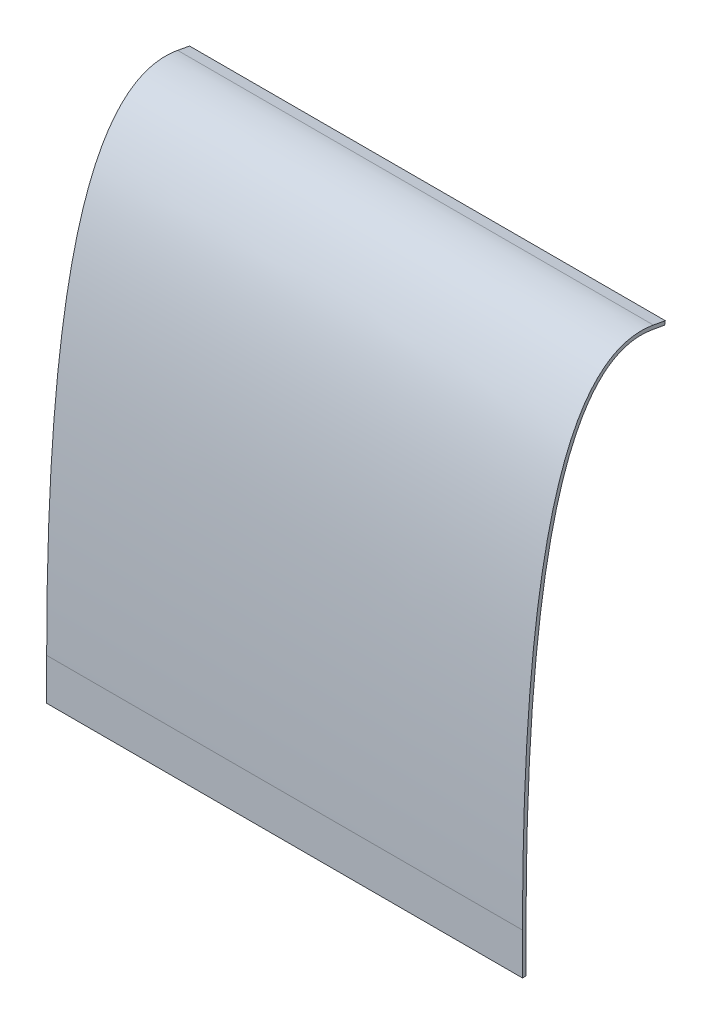
ISO-10303-21;
HEADER;
FILE_DESCRIPTION(('STEP AP214'),'2;1');
FILE_NAME('part.step','',(''),(''),'','','');
FILE_SCHEMA(('AUTOMOTIVE_DESIGN { 1 0 10303 214 1 1 1 1 }'));
ENDSEC;
DATA;
#1=APPLICATION_CONTEXT('core data for automotive mechanical design processes');
#2=APPLICATION_PROTOCOL_DEFINITION('international standard','automotive_design',2000,#1);
#3=PRODUCT_CONTEXT('',#1,'mechanical');
#4=PRODUCT('Part','Part','',(#3));
#5=PRODUCT_RELATED_PRODUCT_CATEGORY('part','',(#4));
#6=PRODUCT_DEFINITION_FORMATION('','',#4);
#7=PRODUCT_DEFINITION_CONTEXT('part definition',#1,'design');
#8=PRODUCT_DEFINITION('design','',#6,#7);
#9=PRODUCT_DEFINITION_SHAPE('','',#8);
#10=(LENGTH_UNIT() NAMED_UNIT(*) SI_UNIT(.MILLI.,.METRE.));
#11=(NAMED_UNIT(*) PLANE_ANGLE_UNIT() SI_UNIT($,.RADIAN.));
#12=(NAMED_UNIT(*) SI_UNIT($,.STERADIAN.) SOLID_ANGLE_UNIT());
#13=UNCERTAINTY_MEASURE_WITH_UNIT(LENGTH_MEASURE(1.E-05),#10,'distance_accuracy_value','');
#14=(GEOMETRIC_REPRESENTATION_CONTEXT(3) GLOBAL_UNCERTAINTY_ASSIGNED_CONTEXT((#13)) GLOBAL_UNIT_ASSIGNED_CONTEXT((#10,
#11,#12)) REPRESENTATION_CONTEXT('',''));
#15=CARTESIAN_POINT('',(0.,0.,0.));
#16=DIRECTION('',(0.,0.,1.));
#17=DIRECTION('',(1.,0.,0.));
#18=AXIS2_PLACEMENT_3D('',#15,#16,#17);
#19=CARTESIAN_POINT('',(0.,-5374.65375184319,3.175));
#20=DIRECTION('',(1.,0.,0.));
#21=DIRECTION('',(0.,1.,0.));
#22=AXIS2_PLACEMENT_3D('',#19,#20,#21);
#23=PLANE('',#22);
#24=DIRECTION('',(0.,-1.,0.));
#25=VECTOR('',#24,1.);
#26=CARTESIAN_POINT('',(0.,-5374.65375184319,0.));
#27=LINE('',#26,#25);
#28=CARTESIAN_POINT('',(0.,-5338.16883094508,0.));
#29=VERTEX_POINT('',#28);
#30=CARTESIAN_POINT('',(0.,-5374.65375184319,0.));
#31=VERTEX_POINT('',#30);
#32=EDGE_CURVE('E71',#29,#31,#27,.T.);
#33=ORIENTED_EDGE('',*,*,#32,.T.);
#34=DIRECTION('',(0.,0.,-1.));
#35=VECTOR('',#34,1.);
#36=CARTESIAN_POINT('',(0.,-5374.65375184319,3.175));
#37=LINE('',#36,#35);
#38=CARTESIAN_POINT('',(0.,-5374.65375184319,3.175));
#39=VERTEX_POINT('',#38);
#40=EDGE_CURVE('E11',#39,#31,#37,.T.);
#41=ORIENTED_EDGE('',*,*,#40,.F.);
#42=DIRECTION('',(0.,-1.,0.));
#43=VECTOR('',#42,1.);
#44=CARTESIAN_POINT('',(0.,-5374.65375184319,3.175));
#45=LINE('',#44,#43);
#46=CARTESIAN_POINT('',(0.,-5338.16883094508,3.175));
#47=VERTEX_POINT('',#46);
#48=EDGE_CURVE('E162',#47,#39,#45,.T.);
#49=ORIENTED_EDGE('',*,*,#48,.F.);
#50=CARTESIAN_POINT('',(0.,-5338.16883094509,3.175000000021));
#51=CARTESIAN_POINT('',(0.,-5335.98734076763,3.17500000002096));
#52=CARTESIAN_POINT('',(0.,-5331.61137520192,3.17046541119789));
#53=CARTESIAN_POINT('',(0.,-5322.96335403543,3.14325696181654));
#54=CARTESIAN_POINT('',(0.,-5312.27638574887,3.07523348435035));
#55=CARTESIAN_POINT('',(0.,-5299.6714073224,2.93917848604919));
#56=CARTESIAN_POINT('',(0.,-5283.14925353709,2.68519354129723));
#57=CARTESIAN_POINT('',(0.,-5263.03358789849,2.23160969948016));
#58=CARTESIAN_POINT('',(0.,-5239.75265206164,1.46947489332904));
#59=CARTESIAN_POINT('',(0.,-5217.32963310162,0.489420194702265));
#60=CARTESIAN_POINT('',(0.,-5188.57565879309,-1.10802295378885));
#61=CARTESIAN_POINT('',(0.,-5154.77627524645,-3.65020946173178));
#62=CARTESIAN_POINT('',(0.,-5117.64263301685,-7.57487259669485));
#63=CARTESIAN_POINT('',(0.,-5083.93016515097,-12.3759483752897));
#64=CARTESIAN_POINT('',(0.,-5053.63287456945,-18.0569483815897));
#65=CARTESIAN_POINT('',(0.,-5017.77931089889,-26.8143362972864));
#66=CARTESIAN_POINT('',(0.,-4988.71861289575,-37.3605308212267));
#67=CARTESIAN_POINT('',(0.,-4966.39885120463,-49.7957669766781));
#68=CARTESIAN_POINT('',(0.,-4953.02734383295,-60.1213480910545));
#69=CARTESIAN_POINT('',(0.,-4943.05871353358,-71.513011287966));
#70=CARTESIAN_POINT('',(0.,-4937.68084608304,-81.9236706532408));
#71=CARTESIAN_POINT('',(0.,-4935.20656234799,-90.7533778061171));
#72=CARTESIAN_POINT('',(0.,-4934.27161001899,-97.5979563520393));
#73=CARTESIAN_POINT('',(0.,-4934.25945037595,-103.474595101734));
#74=CARTESIAN_POINT('',(0.,-4934.70154226425,-108.253920150395));
#75=CARTESIAN_POINT('',(0.,-4935.07716391738,-110.696774930824));
#76=CARTESIAN_POINT('',(0.,-4935.29808523925,-111.902729484393));
#77=B_SPLINE_CURVE_WITH_KNOTS('',3,(#50,#51,#52,#53,#54,#55,#56,#57,#58,#59,#60,#61,#62,#63,#64,
#65,#66,#67,#68,#69,#70,#71,#72,#73,#74,#75,#76),.UNSPECIFIED.,.F.,.F.,(4,1,1,1,1,1,1,1,1,1,1,1,
1,1,1,1,1,1,1,1,1,1,1,1,4),(0.490445446996945,0.490528714033794,0.490611981070643,
0.490778515144341,0.490945049218038,0.491111583291736,0.491444651439131,0.491777719586526,
0.492110787733921,0.492443855881316,0.493109992176106,0.493776128470896,0.494442264765687,
0.495108401060477,0.495774537355267,0.497106809944847,0.497772946239638,0.498439082534428,
0.499105218829218,0.499771355124008,0.500104423271403,0.500437491418798,0.500770559566193,
0.500937093639891,0.501103627713589),.UNSPECIFIED.);
#78=CARTESIAN_POINT('',(0.,-4935.29808523925,-111.902729484393));
#79=VERTEX_POINT('',#78);
#80=EDGE_CURVE('E127',#47,#79,#77,.T.);
#81=ORIENTED_EDGE('',*,*,#80,.T.);
#82=DIRECTION('',(0.,-0.180193443156011,-0.983631192593841));
#83=VECTOR('',#82,1.);
#84=CARTESIAN_POINT('',(0.,-4935.29808523925,-111.902729484393));
#85=LINE('',#84,#83);
#86=CARTESIAN_POINT('',(0.,-4937.21565146267,-122.370246604773));
#87=VERTEX_POINT('',#86);
#88=EDGE_CURVE('E126',#79,#87,#85,.T.);
#89=ORIENTED_EDGE('',*,*,#88,.T.);
#90=DIRECTION('',(0.,-0.983631192592149,0.180193443165247));
#91=VECTOR('',#90,1.);
#92=CARTESIAN_POINT('',(0.,-4940.33868049915,-121.798132422724));
#93=LINE('',#92,#91);
#94=CARTESIAN_POINT('',(0.,-4940.33868049915,-121.798132422724));
#95=VERTEX_POINT('',#94);
#96=EDGE_CURVE('E137',#87,#95,#93,.T.);
#97=ORIENTED_EDGE('',*,*,#96,.T.);
#98=DIRECTION('',(0.,0.180193443165247,0.983631192592149));
#99=VECTOR('',#98,1.);
#100=CARTESIAN_POINT('',(0.,-4938.42111427564,-111.33061530237));
#101=LINE('',#100,#99);
#102=CARTESIAN_POINT('',(0.,-4938.42111427564,-111.33061530237));
#103=VERTEX_POINT('',#102);
#104=EDGE_CURVE('E144',#95,#103,#101,.T.);
#105=ORIENTED_EDGE('',*,*,#104,.T.);
#106=CARTESIAN_POINT('',(0.,-972092.39667576,-254466.03500471));
#107=CARTESIAN_POINT('',(0.,964580.96794132,244923.154052706));
#108=CARTESIAN_POINT('',(0.,-976825.222864024,-235738.146311021));
#109=B_SPLINE_CURVE_WITH_KNOTS('',2,(#106,#107,#108),.UNSPECIFIED.,.F.,.F.,(3,3),(0.,1.),.UNSPECIFIED.);
#110=EDGE_CURVE('E151',#103,#29,#109,.T.);
#111=ORIENTED_EDGE('',*,*,#110,.T.);
#112=EDGE_LOOP('',(#33,#41,#49,#81,#89,#97,#105,#111));
#113=FACE_BOUND('',#112,.T.);
#114=ADVANCED_FACE('F35',(#113),#23,.F.);
#115=CARTESIAN_POINT('',(0.,-5374.65375184319,3.175));
#116=DIRECTION('',(0.,1.,0.));
#117=DIRECTION('',(0.,0.,1.));
#118=AXIS2_PLACEMENT_3D('',#115,#116,#117);
#119=PLANE('',#118);
#120=DIRECTION('',(1.,0.,0.));
#121=VECTOR('',#120,1.);
#122=CARTESIAN_POINT('',(0.,-5374.65375184319,0.));
#123=LINE('',#122,#121);
#124=CARTESIAN_POINT('',(418.07892,-5374.65375184319,0.));
#125=VERTEX_POINT('',#124);
#126=EDGE_CURVE('E64',#31,#125,#123,.T.);
#127=ORIENTED_EDGE('',*,*,#126,.T.);
#128=DIRECTION('',(0.,0.,-1.));
#129=VECTOR('',#128,1.);
#130=CARTESIAN_POINT('',(418.07892,-5374.65375184319,3.175));
#131=LINE('',#130,#129);
#132=CARTESIAN_POINT('',(418.07892,-5374.65375184319,3.175));
#133=VERTEX_POINT('',#132);
#134=EDGE_CURVE('E43',#133,#125,#131,.T.);
#135=ORIENTED_EDGE('',*,*,#134,.F.);
#136=DIRECTION('',(1.,0.,0.));
#137=VECTOR('',#136,1.);
#138=CARTESIAN_POINT('',(0.,-5374.65375184319,3.175));
#139=LINE('',#138,#137);
#140=EDGE_CURVE('E76',#39,#133,#139,.T.);
#141=ORIENTED_EDGE('',*,*,#140,.F.);
#142=ORIENTED_EDGE('',*,*,#40,.T.);
#143=EDGE_LOOP('',(#127,#135,#141,#142));
#144=FACE_BOUND('',#143,.T.);
#145=ADVANCED_FACE('F200',(#144),#119,.F.);
#146=CARTESIAN_POINT('',(418.07892,-5374.65375184319,3.175));
#147=DIRECTION('',(-1.,0.,0.));
#148=DIRECTION('',(0.,0.,1.));
#149=AXIS2_PLACEMENT_3D('',#146,#147,#148);
#150=PLANE('',#149);
#151=DIRECTION('',(0.,1.,0.));
#152=VECTOR('',#151,1.);
#153=CARTESIAN_POINT('',(418.07892,-5374.65375184319,0.));
#154=LINE('',#153,#152);
#155=CARTESIAN_POINT('',(418.07892,-5338.16883094508,-1.33226762955019E-12));
#156=VERTEX_POINT('',#155);
#157=EDGE_CURVE('E174',#125,#156,#154,.T.);
#158=ORIENTED_EDGE('',*,*,#157,.T.);
#159=CARTESIAN_POINT('',(418.07892,-972092.39667576,-254466.03500471));
#160=CARTESIAN_POINT('',(418.07892,964580.96794132,244923.154052706));
#161=CARTESIAN_POINT('',(418.07892,-976825.222864024,-235738.146311021));
#162=B_SPLINE_CURVE_WITH_KNOTS('',2,(#159,#160,#161),.UNSPECIFIED.,.F.,.F.,(3,3),(0.,1.),.UNSPECIFIED.);
#163=CARTESIAN_POINT('',(418.07892,-4938.42111427564,-111.33061530237));
#164=VERTEX_POINT('',#163);
#165=EDGE_CURVE('E131',#164,#156,#162,.T.);
#166=ORIENTED_EDGE('',*,*,#165,.F.);
#167=DIRECTION('',(0.,0.180193443165247,0.983631192592149));
#168=VECTOR('',#167,1.);
#169=CARTESIAN_POINT('',(418.07892,-4938.42111427564,-111.33061530237));
#170=LINE('',#169,#168);
#171=CARTESIAN_POINT('',(418.07892,-4940.33868049915,-121.798132422724));
#172=VERTEX_POINT('',#171);
#173=EDGE_CURVE('E139',#172,#164,#170,.T.);
#174=ORIENTED_EDGE('',*,*,#173,.F.);
#175=DIRECTION('',(0.,-0.983631192592149,0.180193443165247));
#176=VECTOR('',#175,1.);
#177=CARTESIAN_POINT('',(418.07892,-4940.33868049915,-121.798132422724));
#178=LINE('',#177,#176);
#179=CARTESIAN_POINT('',(418.07892,-4937.21565146267,-122.370246604773));
#180=VERTEX_POINT('',#179);
#181=EDGE_CURVE('E112',#180,#172,#178,.T.);
#182=ORIENTED_EDGE('',*,*,#181,.F.);
#183=DIRECTION('',(0.,-0.180193443156011,-0.983631192593841));
#184=VECTOR('',#183,1.);
#185=CARTESIAN_POINT('',(418.07892,-4935.29808523925,-111.902729484393));
#186=LINE('',#185,#184);
#187=CARTESIAN_POINT('',(418.07892,-4935.29808523925,-111.902729484393));
#188=VERTEX_POINT('',#187);
#189=EDGE_CURVE('E105',#188,#180,#186,.T.);
#190=ORIENTED_EDGE('',*,*,#189,.F.);
#191=CARTESIAN_POINT('',(418.07892,-5338.16883094509,3.175000000021));
#192=CARTESIAN_POINT('',(418.07892,-5335.98734076763,3.17500000002096));
#193=CARTESIAN_POINT('',(418.07892,-5331.61137520192,3.17046541119789));
#194=CARTESIAN_POINT('',(418.07892,-5322.96335403543,3.14325696181654));
#195=CARTESIAN_POINT('',(418.07892,-5312.27638574887,3.07523348435035));
#196=CARTESIAN_POINT('',(418.07892,-5299.6714073224,2.93917848604919));
#197=CARTESIAN_POINT('',(418.07892,-5283.14925353709,2.68519354129723));
#198=CARTESIAN_POINT('',(418.07892,-5263.03358789849,2.23160969948016));
#199=CARTESIAN_POINT('',(418.07892,-5239.75265206164,1.46947489332904));
#200=CARTESIAN_POINT('',(418.07892,-5217.32963310162,0.489420194702265));
#201=CARTESIAN_POINT('',(418.07892,-5188.57565879309,-1.10802295378885));
#202=CARTESIAN_POINT('',(418.07892,-5154.77627524645,-3.65020946173178));
#203=CARTESIAN_POINT('',(418.07892,-5117.64263301685,-7.57487259669485));
#204=CARTESIAN_POINT('',(418.07892,-5083.93016515097,-12.3759483752897));
#205=CARTESIAN_POINT('',(418.07892,-5053.63287456945,-18.0569483815897));
#206=CARTESIAN_POINT('',(418.07892,-5017.77931089889,-26.8143362972864));
#207=CARTESIAN_POINT('',(418.07892,-4988.71861289575,-37.3605308212267));
#208=CARTESIAN_POINT('',(418.07892,-4966.39885120463,-49.7957669766781));
#209=CARTESIAN_POINT('',(418.07892,-4953.02734383295,-60.1213480910545));
#210=CARTESIAN_POINT('',(418.07892,-4943.05871353358,-71.513011287966));
#211=CARTESIAN_POINT('',(418.07892,-4937.68084608304,-81.9236706532408));
#212=CARTESIAN_POINT('',(418.07892,-4935.20656234799,-90.7533778061171));
#213=CARTESIAN_POINT('',(418.07892,-4934.27161001899,-97.5979563520393));
#214=CARTESIAN_POINT('',(418.07892,-4934.25945037595,-103.474595101734));
#215=CARTESIAN_POINT('',(418.07892,-4934.70154226425,-108.253920150395));
#216=CARTESIAN_POINT('',(418.07892,-4935.07716391738,-110.696774930824));
#217=CARTESIAN_POINT('',(418.07892,-4935.29808523925,-111.902729484393));
#218=B_SPLINE_CURVE_WITH_KNOTS('',3,(#191,#192,#193,#194,#195,#196,#197,#198,#199,#200,#201,
#202,#203,#204,#205,#206,#207,#208,#209,#210,#211,#212,#213,#214,#215,#216,#217),.UNSPECIFIED.,
.F.,.F.,(4,1,1,1,1,1,1,1,1,1,1,1,1,1,1,1,1,1,1,1,1,1,1,1,4),(0.490445446996945,
0.490528714033794,0.490611981070643,0.490778515144341,0.490945049218038,0.491111583291736,
0.491444651439131,0.491777719586526,0.492110787733921,0.492443855881316,0.493109992176106,
0.493776128470896,0.494442264765687,0.495108401060477,0.495774537355267,0.497106809944847,
0.497772946239638,0.498439082534428,0.499105218829218,0.499771355124008,0.500104423271403,
0.500437491418798,0.500770559566193,0.500937093639891,0.501103627713589),.UNSPECIFIED.);
#219=CARTESIAN_POINT('',(418.07892,-5338.16883094508,3.175));
#220=VERTEX_POINT('',#219);
#221=EDGE_CURVE('E110',#220,#188,#218,.T.);
#222=ORIENTED_EDGE('',*,*,#221,.F.);
#223=DIRECTION('',(0.,1.,0.));
#224=VECTOR('',#223,1.);
#225=CARTESIAN_POINT('',(418.07892,-5374.65375184319,3.175));
#226=LINE('',#225,#224);
#227=EDGE_CURVE('E169',#133,#220,#226,.T.);
#228=ORIENTED_EDGE('',*,*,#227,.F.);
#229=ORIENTED_EDGE('',*,*,#134,.T.);
#230=EDGE_LOOP('',(#158,#166,#174,#182,#190,#222,#228,#229));
#231=FACE_BOUND('',#230,.T.);
#232=ADVANCED_FACE('F108',(#231),#150,.F.);
#233=CARTESIAN_POINT('',(0.,0.,3.175));
#234=DIRECTION('',(0.,0.,-1.));
#235=DIRECTION('',(-1.,0.,0.));
#236=AXIS2_PLACEMENT_3D('',#233,#234,#235);
#237=PLANE('',#236);
#238=ORIENTED_EDGE('',*,*,#48,.T.);
#239=ORIENTED_EDGE('',*,*,#140,.T.);
#240=ORIENTED_EDGE('',*,*,#227,.T.);
#241=DIRECTION('',(-1.,0.,0.));
#242=VECTOR('',#241,1.);
#243=CARTESIAN_POINT('',(0.,-5338.16883094508,3.175));
#244=LINE('',#243,#242);
#245=EDGE_CURVE('E51',#220,#47,#244,.T.);
#246=ORIENTED_EDGE('',*,*,#245,.T.);
#247=EDGE_LOOP('',(#238,#239,#240,#246));
#248=FACE_BOUND('',#247,.T.);
#249=ADVANCED_FACE('F192',(#248),#237,.F.);
#250=CARTESIAN_POINT('',(0.,0.,0.));
#251=DIRECTION('',(0.,0.,-1.));
#252=DIRECTION('',(-1.,0.,0.));
#253=AXIS2_PLACEMENT_3D('',#250,#251,#252);
#254=PLANE('',#253);
#255=ORIENTED_EDGE('',*,*,#32,.F.);
#256=DIRECTION('',(-1.,0.,0.));
#257=VECTOR('',#256,1.);
#258=CARTESIAN_POINT('',(0.,-5338.16883094508,0.));
#259=LINE('',#258,#257);
#260=EDGE_CURVE('E167',#156,#29,#259,.T.);
#261=ORIENTED_EDGE('',*,*,#260,.F.);
#262=ORIENTED_EDGE('',*,*,#157,.F.);
#263=ORIENTED_EDGE('',*,*,#126,.F.);
#264=EDGE_LOOP('',(#255,#261,#262,#263));
#265=FACE_BOUND('',#264,.T.);
#266=ADVANCED_FACE('F178',(#265),#254,.T.);
#267=CARTESIAN_POINT('',(418.07892,-5338.16883094509,3.175000000021));
#268=CARTESIAN_POINT('',(0.,-5338.16883094509,3.175000000021));
#269=CARTESIAN_POINT('',(418.07892,-5335.98734076763,3.17500000002096));
#270=CARTESIAN_POINT('',(0.,-5335.98734076763,3.17500000002096));
#271=CARTESIAN_POINT('',(418.07892,-5331.61137520192,3.17046541119789));
#272=CARTESIAN_POINT('',(0.,-5331.61137520192,3.17046541119789));
#273=CARTESIAN_POINT('',(418.07892,-5322.96335403543,3.14325696181654));
#274=CARTESIAN_POINT('',(0.,-5322.96335403543,3.14325696181654));
#275=CARTESIAN_POINT('',(418.07892,-5312.27638574887,3.07523348435035));
#276=CARTESIAN_POINT('',(0.,-5312.27638574887,3.07523348435035));
#277=CARTESIAN_POINT('',(418.07892,-5299.6714073224,2.93917848604919));
#278=CARTESIAN_POINT('',(0.,-5299.6714073224,2.93917848604919));
#279=CARTESIAN_POINT('',(418.07892,-5283.14925353709,2.68519354129723));
#280=CARTESIAN_POINT('',(0.,-5283.14925353709,2.68519354129723));
#281=CARTESIAN_POINT('',(418.07892,-5263.03358789849,2.23160969948016));
#282=CARTESIAN_POINT('',(0.,-5263.03358789849,2.23160969948016));
#283=CARTESIAN_POINT('',(418.07892,-5239.75265206164,1.46947489332904));
#284=CARTESIAN_POINT('',(0.,-5239.75265206164,1.46947489332904));
#285=CARTESIAN_POINT('',(418.07892,-5217.32963310162,0.489420194702265));
#286=CARTESIAN_POINT('',(0.,-5217.32963310162,0.489420194702265));
#287=CARTESIAN_POINT('',(418.07892,-5188.57565879309,-1.10802295378885));
#288=CARTESIAN_POINT('',(0.,-5188.57565879309,-1.10802295378885));
#289=CARTESIAN_POINT('',(418.07892,-5154.77627524645,-3.65020946173178));
#290=CARTESIAN_POINT('',(0.,-5154.77627524645,-3.65020946173178));
#291=CARTESIAN_POINT('',(418.07892,-5117.64263301685,-7.57487259669485));
#292=CARTESIAN_POINT('',(0.,-5117.64263301685,-7.57487259669485));
#293=CARTESIAN_POINT('',(418.07892,-5083.93016515097,-12.3759483752897));
#294=CARTESIAN_POINT('',(0.,-5083.93016515097,-12.3759483752897));
#295=CARTESIAN_POINT('',(418.07892,-5053.63287456945,-18.0569483815897));
#296=CARTESIAN_POINT('',(0.,-5053.63287456945,-18.0569483815897));
#297=CARTESIAN_POINT('',(418.07892,-5017.77931089889,-26.8143362972864));
#298=CARTESIAN_POINT('',(0.,-5017.77931089889,-26.8143362972864));
#299=CARTESIAN_POINT('',(418.07892,-4988.71861289575,-37.3605308212267));
#300=CARTESIAN_POINT('',(0.,-4988.71861289575,-37.3605308212267));
#301=CARTESIAN_POINT('',(418.07892,-4966.39885120463,-49.7957669766781));
#302=CARTESIAN_POINT('',(0.,-4966.39885120463,-49.7957669766781));
#303=CARTESIAN_POINT('',(418.07892,-4953.02734383295,-60.1213480910545));
#304=CARTESIAN_POINT('',(0.,-4953.02734383295,-60.1213480910545));
#305=CARTESIAN_POINT('',(418.07892,-4943.05871353358,-71.513011287966));
#306=CARTESIAN_POINT('',(0.,-4943.05871353358,-71.513011287966));
#307=CARTESIAN_POINT('',(418.07892,-4937.68084608304,-81.9236706532408));
#308=CARTESIAN_POINT('',(0.,-4937.68084608304,-81.9236706532408));
#309=CARTESIAN_POINT('',(418.07892,-4935.20656234799,-90.7533778061171));
#310=CARTESIAN_POINT('',(0.,-4935.20656234799,-90.7533778061171));
#311=CARTESIAN_POINT('',(418.07892,-4934.27161001899,-97.5979563520393));
#312=CARTESIAN_POINT('',(0.,-4934.27161001899,-97.5979563520393));
#313=CARTESIAN_POINT('',(418.07892,-4934.25945037595,-103.474595101734));
#314=CARTESIAN_POINT('',(0.,-4934.25945037595,-103.474595101734));
#315=CARTESIAN_POINT('',(418.07892,-4934.70154226425,-108.253920150395));
#316=CARTESIAN_POINT('',(0.,-4934.70154226425,-108.253920150395));
#317=CARTESIAN_POINT('',(418.07892,-4935.07716391738,-110.696774930824));
#318=CARTESIAN_POINT('',(0.,-4935.07716391738,-110.696774930824));
#319=CARTESIAN_POINT('',(418.07892,-4935.29808523925,-111.902729484393));
#320=CARTESIAN_POINT('',(0.,-4935.29808523925,-111.902729484393));
#321=B_SPLINE_SURFACE_WITH_KNOTS('',3,1,((#267,#268),(#269,#270),(#271,#272),(#273,#274),(#275,
#276),(#277,#278),(#279,#280),(#281,#282),(#283,#284),(#285,#286),(#287,#288),(#289,#290),(#291,
#292),(#293,#294),(#295,#296),(#297,#298),(#299,#300),(#301,#302),(#303,#304),(#305,#306),(#307,
#308),(#309,#310),(#311,#312),(#313,#314),(#315,#316),(#317,#318),(#319,#320)),.UNSPECIFIED.,
.F.,.F.,.F.,(4,1,1,1,1,1,1,1,1,1,1,1,1,1,1,1,1,1,1,1,1,1,1,1,4),(2,2),(0.,0.00781249999999719,
0.0156249999999996,0.0312500000000044,0.046875000000004,0.0625000000000036,0.0937500000000028,
0.125000000000002,0.156250000000001,0.1875,0.249999999999999,0.312499999999997,
0.375000000000001,0.437500000000004,0.500000000000003,0.624999999999999,0.687499999999998,
0.750000000000001,0.812500000000005,0.875000000000003,0.906250000000002,0.937500000000002,
0.968750000000001,0.984374999999995,1.),(0.,1.),.UNSPECIFIED.);
#322=DIRECTION('',(-1.,0.,0.));
#323=VECTOR('',#322,1.);
#324=CARTESIAN_POINT('',(418.07892,-4935.29808523925,-111.902729484393));
#325=LINE('',#324,#323);
#326=EDGE_CURVE('E122',#188,#79,#325,.T.);
#327=ORIENTED_EDGE('',*,*,#326,.T.);
#328=ORIENTED_EDGE('',*,*,#80,.F.);
#329=ORIENTED_EDGE('',*,*,#245,.F.);
#330=ORIENTED_EDGE('',*,*,#221,.T.);
#331=EDGE_LOOP('',(#327,#328,#329,#330));
#332=FACE_BOUND('',#331,.T.);
#333=ADVANCED_FACE('F120',(#332),#321,.T.);
#334=CARTESIAN_POINT('',(418.07892,-4935.29808523925,-111.902729484393));
#335=DIRECTION('',(0.,0.983631192593841,-0.180193443156011));
#336=DIRECTION('',(0.,0.180193443156011,0.983631192593841));
#337=AXIS2_PLACEMENT_3D('',#334,#335,#336);
#338=PLANE('',#337);
#339=DIRECTION('',(-1.,0.,0.));
#340=VECTOR('',#339,1.);
#341=CARTESIAN_POINT('',(418.07892,-4937.21565146267,-122.370246604773));
#342=LINE('',#341,#340);
#343=EDGE_CURVE('E129',#180,#87,#342,.T.);
#344=ORIENTED_EDGE('',*,*,#343,.T.);
#345=ORIENTED_EDGE('',*,*,#88,.F.);
#346=ORIENTED_EDGE('',*,*,#326,.F.);
#347=ORIENTED_EDGE('',*,*,#189,.T.);
#348=EDGE_LOOP('',(#344,#345,#346,#347));
#349=FACE_BOUND('',#348,.T.);
#350=ADVANCED_FACE('F125',(#349),#338,.T.);
#351=CARTESIAN_POINT('',(418.07892,-4940.33868049915,-121.798132422724));
#352=DIRECTION('',(0.,-0.180193443165247,-0.983631192592149));
#353=DIRECTION('',(0.,0.983631192592149,-0.180193443165247));
#354=AXIS2_PLACEMENT_3D('',#351,#352,#353);
#355=PLANE('',#354);
#356=DIRECTION('',(-1.,0.,0.));
#357=VECTOR('',#356,1.);
#358=CARTESIAN_POINT('',(418.07892,-4940.33868049915,-121.798132422724));
#359=LINE('',#358,#357);
#360=EDGE_CURVE('E141',#172,#95,#359,.T.);
#361=ORIENTED_EDGE('',*,*,#360,.T.);
#362=ORIENTED_EDGE('',*,*,#96,.F.);
#363=ORIENTED_EDGE('',*,*,#343,.F.);
#364=ORIENTED_EDGE('',*,*,#181,.T.);
#365=EDGE_LOOP('',(#361,#362,#363,#364));
#366=FACE_BOUND('',#365,.T.);
#367=ADVANCED_FACE('F189',(#366),#355,.T.);
#368=CARTESIAN_POINT('',(418.07892,-4938.42111427564,-111.33061530237));
#369=DIRECTION('',(0.,-0.983631192592149,0.180193443165247));
#370=DIRECTION('',(0.,-0.180193443165247,-0.983631192592149));
#371=AXIS2_PLACEMENT_3D('',#368,#369,#370);
#372=PLANE('',#371);
#373=DIRECTION('',(-1.,0.,0.));
#374=VECTOR('',#373,1.);
#375=CARTESIAN_POINT('',(418.07892,-4938.42111427564,-111.33061530237));
#376=LINE('',#375,#374);
#377=EDGE_CURVE('E148',#164,#103,#376,.T.);
#378=ORIENTED_EDGE('',*,*,#377,.T.);
#379=ORIENTED_EDGE('',*,*,#104,.F.);
#380=ORIENTED_EDGE('',*,*,#360,.F.);
#381=ORIENTED_EDGE('',*,*,#173,.T.);
#382=EDGE_LOOP('',(#378,#379,#380,#381));
#383=FACE_BOUND('',#382,.T.);
#384=ADVANCED_FACE('F185',(#383),#372,.T.);
#385=CARTESIAN_POINT('',(418.07892,-4938.42111427576,-111.330615302348));
#386=CARTESIAN_POINT('',(0.,-4938.42111427576,-111.330615302348));
#387=CARTESIAN_POINT('',(418.07892,-4918.02622739935,7.71605002114484E-12));
#388=CARTESIAN_POINT('',(0.,-4918.02622739935,7.71605002114484E-12));
#389=CARTESIAN_POINT('',(418.07892,-5338.16883094512,1.65818488246634E-11));
#390=CARTESIAN_POINT('',(0.,-5338.16883094512,1.65818488246634E-11));
#391=B_SPLINE_SURFACE_WITH_KNOTS('',2,1,((#385,#386),(#387,#388),(#389,#390)),.UNSPECIFIED.,.F.,
.F.,.F.,(3,3),(2,2),(0.,1.),(0.,1.),.UNSPECIFIED.);
#392=ORIENTED_EDGE('',*,*,#260,.T.);
#393=ORIENTED_EDGE('',*,*,#110,.F.);
#394=ORIENTED_EDGE('',*,*,#377,.F.);
#395=ORIENTED_EDGE('',*,*,#165,.T.);
#396=EDGE_LOOP('',(#392,#393,#394,#395));
#397=FACE_BOUND('',#396,.T.);
#398=ADVANCED_FACE('F181',(#397),#391,.T.);
#399=CLOSED_SHELL('',(#114,#145,#232,#249,#266,#333,#350,#367,#384,#398));
#400=MANIFOLD_SOLID_BREP('B2',#399);
#401=ADVANCED_BREP_SHAPE_REPRESENTATION('',(#18,#400),#14);
#402=SHAPE_DEFINITION_REPRESENTATION(#9,#401);
ENDSEC;
END-ISO-10303-21;
